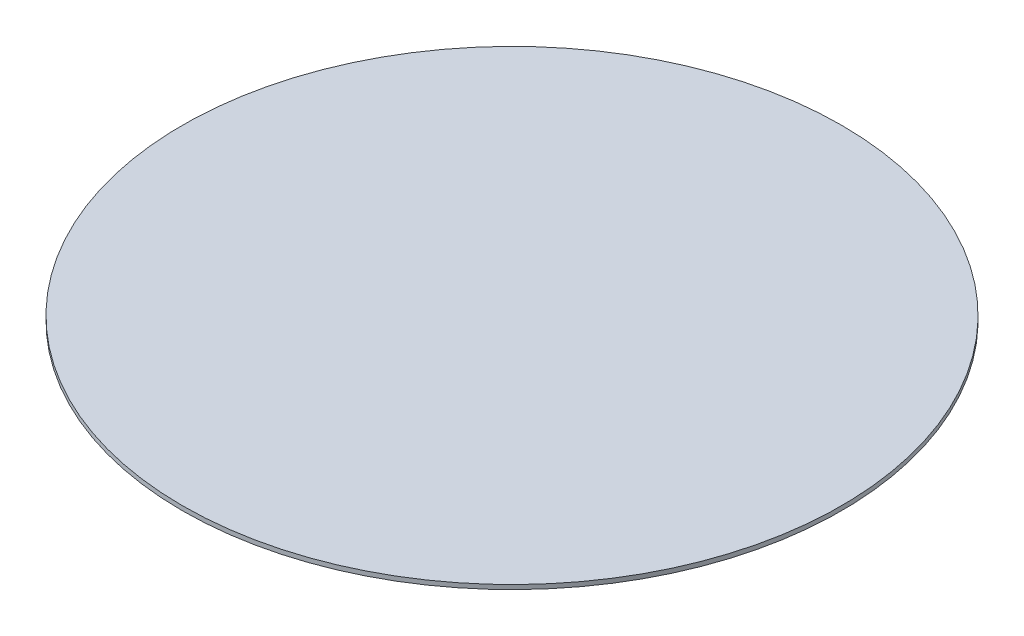
ISO-10303-21;
HEADER;
FILE_DESCRIPTION(('STEP AP214'),'2;1');
FILE_NAME('part.step','',(''),(''),'','','');
FILE_SCHEMA(('AUTOMOTIVE_DESIGN { 1 0 10303 214 1 1 1 1 }'));
ENDSEC;
DATA;
#1=APPLICATION_CONTEXT('core data for automotive mechanical design processes');
#2=APPLICATION_PROTOCOL_DEFINITION('international standard','automotive_design',2000,#1);
#3=PRODUCT_CONTEXT('',#1,'mechanical');
#4=PRODUCT('Part','Part','',(#3));
#5=PRODUCT_RELATED_PRODUCT_CATEGORY('part','',(#4));
#6=PRODUCT_DEFINITION_FORMATION('','',#4);
#7=PRODUCT_DEFINITION_CONTEXT('part definition',#1,'design');
#8=PRODUCT_DEFINITION('design','',#6,#7);
#9=PRODUCT_DEFINITION_SHAPE('','',#8);
#10=(LENGTH_UNIT() NAMED_UNIT(*) SI_UNIT(.MILLI.,.METRE.));
#11=(NAMED_UNIT(*) PLANE_ANGLE_UNIT() SI_UNIT($,.RADIAN.));
#12=(NAMED_UNIT(*) SI_UNIT($,.STERADIAN.) SOLID_ANGLE_UNIT());
#13=UNCERTAINTY_MEASURE_WITH_UNIT(LENGTH_MEASURE(1.E-05),#10,'distance_accuracy_value','');
#14=(GEOMETRIC_REPRESENTATION_CONTEXT(3) GLOBAL_UNCERTAINTY_ASSIGNED_CONTEXT((#13)) GLOBAL_UNIT_ASSIGNED_CONTEXT((#10,
#11,#12)) REPRESENTATION_CONTEXT('',''));
#15=CARTESIAN_POINT('',(0.,0.,0.));
#16=DIRECTION('',(0.,0.,1.));
#17=DIRECTION('',(1.,0.,0.));
#18=AXIS2_PLACEMENT_3D('',#15,#16,#17);
#19=CARTESIAN_POINT('',(0.,0.8,0.));
#20=DIRECTION('',(0.,-1.,0.));
#21=DIRECTION('',(0.,0.,-1.));
#22=AXIS2_PLACEMENT_3D('',#19,#20,#21);
#23=CYLINDRICAL_SURFACE('',#22,60.);
#24=CARTESIAN_POINT('',(0.,0.8,0.));
#25=DIRECTION('',(0.,1.,0.));
#26=DIRECTION('',(0.,0.,1.));
#27=AXIS2_PLACEMENT_3D('',#24,#25,#26);
#28=CIRCLE('',#27,60.);
#29=CARTESIAN_POINT('',(0.,0.8,60.));
#30=VERTEX_POINT('',#29);
#31=EDGE_CURVE('E10',#30,#30,#28,.T.);
#32=ORIENTED_EDGE('',*,*,#31,.F.);
#33=EDGE_LOOP('',(#32));
#34=FACE_BOUND('',#33,.T.);
#35=CARTESIAN_POINT('',(0.,0.,0.));
#36=DIRECTION('',(0.,1.,0.));
#37=DIRECTION('',(0.,0.,1.));
#38=AXIS2_PLACEMENT_3D('',#35,#36,#37);
#39=CIRCLE('',#38,60.);
#40=CARTESIAN_POINT('',(0.,0.,60.));
#41=VERTEX_POINT('',#40);
#42=EDGE_CURVE('E33',#41,#41,#39,.T.);
#43=ORIENTED_EDGE('',*,*,#42,.T.);
#44=EDGE_LOOP('',(#43));
#45=FACE_BOUND('',#44,.T.);
#46=ADVANCED_FACE('F30',(#34,#45),#23,.T.);
#47=CARTESIAN_POINT('',(0.,0.8,0.));
#48=DIRECTION('',(0.,1.,0.));
#49=DIRECTION('',(0.,0.,1.));
#50=AXIS2_PLACEMENT_3D('',#47,#48,#49);
#51=PLANE('',#50);
#52=ORIENTED_EDGE('',*,*,#31,.T.);
#53=EDGE_LOOP('',(#52));
#54=FACE_BOUND('',#53,.T.);
#55=ADVANCED_FACE('F45',(#54),#51,.T.);
#56=CARTESIAN_POINT('',(0.,0.,0.));
#57=DIRECTION('',(0.,1.,0.));
#58=DIRECTION('',(0.,0.,1.));
#59=AXIS2_PLACEMENT_3D('',#56,#57,#58);
#60=PLANE('',#59);
#61=ORIENTED_EDGE('',*,*,#42,.F.);
#62=EDGE_LOOP('',(#61));
#63=FACE_BOUND('',#62,.T.);
#64=ADVANCED_FACE('F43',(#63),#60,.F.);
#65=CLOSED_SHELL('',(#46,#55,#64));
#66=MANIFOLD_SOLID_BREP('B2',#65);
#67=ADVANCED_BREP_SHAPE_REPRESENTATION('',(#18,#66),#14);
#68=SHAPE_DEFINITION_REPRESENTATION(#9,#67);
ENDSEC;
END-ISO-10303-21;
